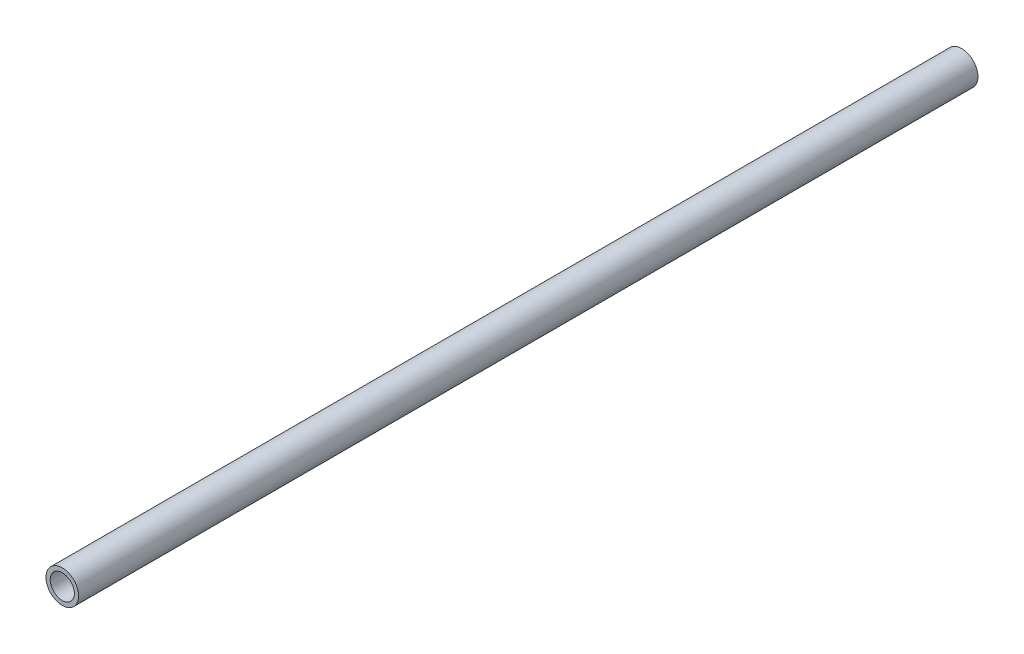
ISO-10303-21;
HEADER;
FILE_DESCRIPTION(('STEP AP214'),'2;1');
FILE_NAME('part.step','',(''),(''),'','','');
FILE_SCHEMA(('AUTOMOTIVE_DESIGN { 1 0 10303 214 1 1 1 1 }'));
ENDSEC;
DATA;
#1=APPLICATION_CONTEXT('core data for automotive mechanical design processes');
#2=APPLICATION_PROTOCOL_DEFINITION('international standard','automotive_design',2000,#1);
#3=PRODUCT_CONTEXT('',#1,'mechanical');
#4=PRODUCT('Part','Part','',(#3));
#5=PRODUCT_RELATED_PRODUCT_CATEGORY('part','',(#4));
#6=PRODUCT_DEFINITION_FORMATION('','',#4);
#7=PRODUCT_DEFINITION_CONTEXT('part definition',#1,'design');
#8=PRODUCT_DEFINITION('design','',#6,#7);
#9=PRODUCT_DEFINITION_SHAPE('','',#8);
#10=(LENGTH_UNIT() NAMED_UNIT(*) SI_UNIT(.MILLI.,.METRE.));
#11=(NAMED_UNIT(*) PLANE_ANGLE_UNIT() SI_UNIT($,.RADIAN.));
#12=(NAMED_UNIT(*) SI_UNIT($,.STERADIAN.) SOLID_ANGLE_UNIT());
#13=UNCERTAINTY_MEASURE_WITH_UNIT(LENGTH_MEASURE(1.E-05),#10,'distance_accuracy_value','');
#14=(GEOMETRIC_REPRESENTATION_CONTEXT(3) GLOBAL_UNCERTAINTY_ASSIGNED_CONTEXT((#13)) GLOBAL_UNIT_ASSIGNED_CONTEXT((#10,
#11,#12)) REPRESENTATION_CONTEXT('',''));
#15=CARTESIAN_POINT('',(0.,0.,0.));
#16=DIRECTION('',(0.,0.,1.));
#17=DIRECTION('',(1.,0.,0.));
#18=AXIS2_PLACEMENT_3D('',#15,#16,#17);
#19=CARTESIAN_POINT('',(0.,0.,-367.960512242138));
#20=DIRECTION('',(0.,0.,1.));
#21=DIRECTION('',(1.,0.,0.));
#22=AXIS2_PLACEMENT_3D('',#19,#20,#21);
#23=CYLINDRICAL_SURFACE('',#22,6.35);
#24=CARTESIAN_POINT('',(0.,0.,-350.));
#25=DIRECTION('',(0.,0.,1.));
#26=DIRECTION('',(1.,0.,0.));
#27=AXIS2_PLACEMENT_3D('',#24,#25,#26);
#28=CIRCLE('',#27,6.35);
#29=CARTESIAN_POINT('',(6.35,0.,-350.));
#30=VERTEX_POINT('',#29);
#31=EDGE_CURVE('E46',#30,#30,#28,.F.);
#32=ORIENTED_EDGE('',*,*,#31,.F.);
#33=EDGE_LOOP('',(#32));
#34=FACE_BOUND('',#33,.T.);
#35=CARTESIAN_POINT('',(0.,0.,0.));
#36=DIRECTION('',(0.,0.,1.));
#37=DIRECTION('',(1.,0.,0.));
#38=AXIS2_PLACEMENT_3D('',#35,#36,#37);
#39=CIRCLE('',#38,6.35);
#40=CARTESIAN_POINT('',(6.35,0.,0.));
#41=VERTEX_POINT('',#40);
#42=EDGE_CURVE('E50',#41,#41,#39,.T.);
#43=ORIENTED_EDGE('',*,*,#42,.F.);
#44=EDGE_LOOP('',(#43));
#45=FACE_BOUND('',#44,.T.);
#46=ADVANCED_FACE('F40',(#34,#45),#23,.T.);
#47=CARTESIAN_POINT('',(0.,0.,0.));
#48=DIRECTION('',(0.,0.,1.));
#49=DIRECTION('',(1.,0.,0.));
#50=AXIS2_PLACEMENT_3D('',#47,#48,#49);
#51=PLANE('',#50);
#52=CARTESIAN_POINT('',(0.,0.,0.));
#53=DIRECTION('',(0.,0.,1.));
#54=DIRECTION('',(1.,0.,0.));
#55=AXIS2_PLACEMENT_3D('',#52,#53,#54);
#56=CIRCLE('',#55,4.699);
#57=CARTESIAN_POINT('',(4.699,0.,0.));
#58=VERTEX_POINT('',#57);
#59=EDGE_CURVE('E55',#58,#58,#56,.T.);
#60=ORIENTED_EDGE('',*,*,#59,.F.);
#61=EDGE_LOOP('',(#60));
#62=FACE_BOUND('',#61,.T.);
#63=ORIENTED_EDGE('',*,*,#42,.T.);
#64=EDGE_LOOP('',(#63));
#65=FACE_BOUND('',#64,.T.);
#66=ADVANCED_FACE('F62',(#62,#65),#51,.T.);
#67=CARTESIAN_POINT('',(0.,0.,-367.960512242138));
#68=DIRECTION('',(0.,0.,1.));
#69=DIRECTION('',(1.,0.,0.));
#70=AXIS2_PLACEMENT_3D('',#67,#68,#69);
#71=CYLINDRICAL_SURFACE('',#70,4.699);
#72=CARTESIAN_POINT('',(0.,0.,-350.));
#73=DIRECTION('',(0.,0.,1.));
#74=DIRECTION('',(1.,0.,0.));
#75=AXIS2_PLACEMENT_3D('',#72,#73,#74);
#76=CIRCLE('',#75,4.699);
#77=CARTESIAN_POINT('',(4.699,0.,-350.));
#78=VERTEX_POINT('',#77);
#79=EDGE_CURVE('E12',#78,#78,#76,.F.);
#80=ORIENTED_EDGE('',*,*,#79,.T.);
#81=EDGE_LOOP('',(#80));
#82=FACE_BOUND('',#81,.T.);
#83=ORIENTED_EDGE('',*,*,#59,.T.);
#84=EDGE_LOOP('',(#83));
#85=FACE_BOUND('',#84,.T.);
#86=ADVANCED_FACE('F60',(#82,#85),#71,.F.);
#87=CARTESIAN_POINT('',(524.5,80.8308992962194,-350.));
#88=DIRECTION('',(0.,0.,1.));
#89=DIRECTION('',(1.,0.,0.));
#90=AXIS2_PLACEMENT_3D('',#87,#88,#89);
#91=PLANE('',#90);
#92=ORIENTED_EDGE('',*,*,#31,.T.);
#93=EDGE_LOOP('',(#92));
#94=FACE_BOUND('',#93,.T.);
#95=ORIENTED_EDGE('',*,*,#79,.F.);
#96=EDGE_LOOP('',(#95));
#97=FACE_BOUND('',#96,.T.);
#98=ADVANCED_FACE('F81',(#94,#97),#91,.F.);
#99=CLOSED_SHELL('',(#46,#66,#86,#98));
#100=MANIFOLD_SOLID_BREP('B2',#99);
#101=ADVANCED_BREP_SHAPE_REPRESENTATION('',(#18,#100),#14);
#102=SHAPE_DEFINITION_REPRESENTATION(#9,#101);
ENDSEC;
END-ISO-10303-21;
